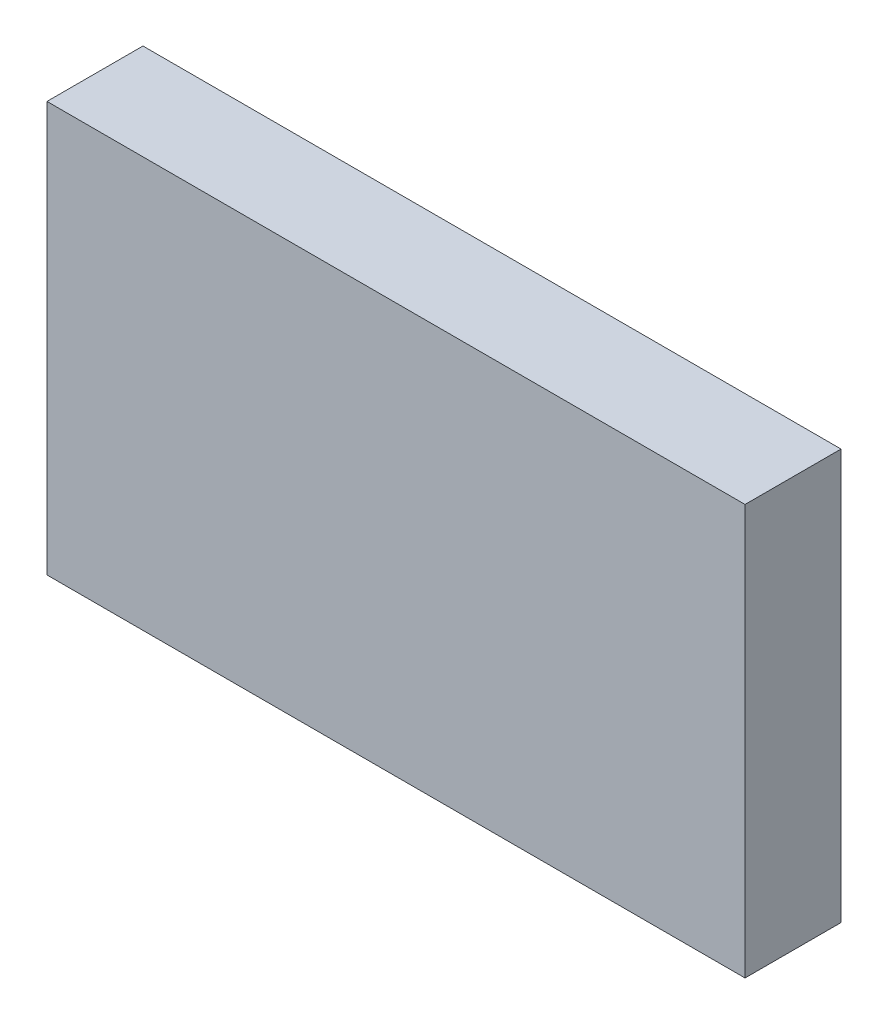
ISO-10303-21;
HEADER;
FILE_DESCRIPTION(('STEP AP214'),'2;1');
FILE_NAME('part.step','',(''),(''),'','','');
FILE_SCHEMA(('AUTOMOTIVE_DESIGN { 1 0 10303 214 1 1 1 1 }'));
ENDSEC;
DATA;
#1=APPLICATION_CONTEXT('core data for automotive mechanical design processes');
#2=APPLICATION_PROTOCOL_DEFINITION('international standard','automotive_design',2000,#1);
#3=PRODUCT_CONTEXT('',#1,'mechanical');
#4=PRODUCT('Part','Part','',(#3));
#5=PRODUCT_RELATED_PRODUCT_CATEGORY('part','',(#4));
#6=PRODUCT_DEFINITION_FORMATION('','',#4);
#7=PRODUCT_DEFINITION_CONTEXT('part definition',#1,'design');
#8=PRODUCT_DEFINITION('design','',#6,#7);
#9=PRODUCT_DEFINITION_SHAPE('','',#8);
#10=(LENGTH_UNIT() NAMED_UNIT(*) SI_UNIT(.MILLI.,.METRE.));
#11=(NAMED_UNIT(*) PLANE_ANGLE_UNIT() SI_UNIT($,.RADIAN.));
#12=(NAMED_UNIT(*) SI_UNIT($,.STERADIAN.) SOLID_ANGLE_UNIT());
#13=UNCERTAINTY_MEASURE_WITH_UNIT(LENGTH_MEASURE(1.E-05),#10,'distance_accuracy_value','');
#14=(GEOMETRIC_REPRESENTATION_CONTEXT(3) GLOBAL_UNCERTAINTY_ASSIGNED_CONTEXT((#13)) GLOBAL_UNIT_ASSIGNED_CONTEXT((#10,
#11,#12)) REPRESENTATION_CONTEXT('',''));
#15=CARTESIAN_POINT('',(0.,0.,0.));
#16=DIRECTION('',(0.,0.,1.));
#17=DIRECTION('',(1.,0.,0.));
#18=AXIS2_PLACEMENT_3D('',#15,#16,#17);
#19=CARTESIAN_POINT('',(-16.,-9.4,4.4));
#20=DIRECTION('',(-1.,0.,0.));
#21=DIRECTION('',(0.,0.,1.));
#22=AXIS2_PLACEMENT_3D('',#19,#20,#21);
#23=PLANE('',#22);
#24=DIRECTION('',(0.,1.,0.));
#25=VECTOR('',#24,1.);
#26=CARTESIAN_POINT('',(-16.,-9.4,0.));
#27=LINE('',#26,#25);
#28=CARTESIAN_POINT('',(-16.,-9.4,0.));
#29=VERTEX_POINT('',#28);
#30=CARTESIAN_POINT('',(-16.,9.4,0.));
#31=VERTEX_POINT('',#30);
#32=EDGE_CURVE('E104',#29,#31,#27,.T.);
#33=ORIENTED_EDGE('',*,*,#32,.F.);
#34=DIRECTION('',(0.,0.,-1.));
#35=VECTOR('',#34,1.);
#36=CARTESIAN_POINT('',(-16.,-9.4,4.4));
#37=LINE('',#36,#35);
#38=CARTESIAN_POINT('',(-16.,-9.4,4.4));
#39=VERTEX_POINT('',#38);
#40=EDGE_CURVE('E11',#39,#29,#37,.T.);
#41=ORIENTED_EDGE('',*,*,#40,.F.);
#42=DIRECTION('',(0.,1.,0.));
#43=VECTOR('',#42,1.);
#44=CARTESIAN_POINT('',(-16.,-9.4,4.4));
#45=LINE('',#44,#43);
#46=CARTESIAN_POINT('',(-16.,9.4,4.4));
#47=VERTEX_POINT('',#46);
#48=EDGE_CURVE('E99',#39,#47,#45,.T.);
#49=ORIENTED_EDGE('',*,*,#48,.T.);
#50=DIRECTION('',(0.,0.,-1.));
#51=VECTOR('',#50,1.);
#52=CARTESIAN_POINT('',(-16.,9.4,4.4));
#53=LINE('',#52,#51);
#54=EDGE_CURVE('E42',#47,#31,#53,.T.);
#55=ORIENTED_EDGE('',*,*,#54,.T.);
#56=EDGE_LOOP('',(#33,#41,#49,#55));
#57=FACE_BOUND('',#56,.T.);
#58=ADVANCED_FACE('F39',(#57),#23,.T.);
#59=CARTESIAN_POINT('',(-16.,-9.4,4.4));
#60=DIRECTION('',(0.,1.,0.));
#61=DIRECTION('',(0.,0.,1.));
#62=AXIS2_PLACEMENT_3D('',#59,#60,#61);
#63=PLANE('',#62);
#64=DIRECTION('',(1.,0.,0.));
#65=VECTOR('',#64,1.);
#66=CARTESIAN_POINT('',(-16.,-9.4,0.));
#67=LINE('',#66,#65);
#68=CARTESIAN_POINT('',(16.,-9.4,0.));
#69=VERTEX_POINT('',#68);
#70=EDGE_CURVE('E72',#29,#69,#67,.T.);
#71=ORIENTED_EDGE('',*,*,#70,.T.);
#72=DIRECTION('',(0.,0.,-1.));
#73=VECTOR('',#72,1.);
#74=CARTESIAN_POINT('',(16.,-9.4,4.4));
#75=LINE('',#74,#73);
#76=CARTESIAN_POINT('',(16.,-9.4,4.4));
#77=VERTEX_POINT('',#76);
#78=EDGE_CURVE('E48',#77,#69,#75,.T.);
#79=ORIENTED_EDGE('',*,*,#78,.F.);
#80=DIRECTION('',(1.,0.,0.));
#81=VECTOR('',#80,1.);
#82=CARTESIAN_POINT('',(-16.,-9.4,4.4));
#83=LINE('',#82,#81);
#84=EDGE_CURVE('E89',#39,#77,#83,.T.);
#85=ORIENTED_EDGE('',*,*,#84,.F.);
#86=ORIENTED_EDGE('',*,*,#40,.T.);
#87=EDGE_LOOP('',(#71,#79,#85,#86));
#88=FACE_BOUND('',#87,.T.);
#89=ADVANCED_FACE('F114',(#88),#63,.F.);
#90=CARTESIAN_POINT('',(16.,-9.4,4.4));
#91=DIRECTION('',(-1.,0.,0.));
#92=DIRECTION('',(0.,0.,1.));
#93=AXIS2_PLACEMENT_3D('',#90,#91,#92);
#94=PLANE('',#93);
#95=DIRECTION('',(0.,1.,0.));
#96=VECTOR('',#95,1.);
#97=CARTESIAN_POINT('',(16.,-9.4,0.));
#98=LINE('',#97,#96);
#99=CARTESIAN_POINT('',(16.,9.4,0.));
#100=VERTEX_POINT('',#99);
#101=EDGE_CURVE('E96',#69,#100,#98,.T.);
#102=ORIENTED_EDGE('',*,*,#101,.T.);
#103=DIRECTION('',(0.,0.,-1.));
#104=VECTOR('',#103,1.);
#105=CARTESIAN_POINT('',(16.,9.4,4.4));
#106=LINE('',#105,#104);
#107=CARTESIAN_POINT('',(16.,9.4,4.4));
#108=VERTEX_POINT('',#107);
#109=EDGE_CURVE('E93',#108,#100,#106,.T.);
#110=ORIENTED_EDGE('',*,*,#109,.F.);
#111=DIRECTION('',(0.,1.,0.));
#112=VECTOR('',#111,1.);
#113=CARTESIAN_POINT('',(16.,-9.4,4.4));
#114=LINE('',#113,#112);
#115=EDGE_CURVE('E84',#77,#108,#114,.T.);
#116=ORIENTED_EDGE('',*,*,#115,.F.);
#117=ORIENTED_EDGE('',*,*,#78,.T.);
#118=EDGE_LOOP('',(#102,#110,#116,#117));
#119=FACE_BOUND('',#118,.T.);
#120=ADVANCED_FACE('F94',(#119),#94,.F.);
#121=CARTESIAN_POINT('',(-16.,9.4,4.4));
#122=DIRECTION('',(0.,1.,0.));
#123=DIRECTION('',(0.,0.,1.));
#124=AXIS2_PLACEMENT_3D('',#121,#122,#123);
#125=PLANE('',#124);
#126=DIRECTION('',(1.,0.,0.));
#127=VECTOR('',#126,1.);
#128=CARTESIAN_POINT('',(-16.,9.4,0.));
#129=LINE('',#128,#127);
#130=EDGE_CURVE('E107',#31,#100,#129,.T.);
#131=ORIENTED_EDGE('',*,*,#130,.F.);
#132=ORIENTED_EDGE('',*,*,#54,.F.);
#133=DIRECTION('',(1.,0.,0.));
#134=VECTOR('',#133,1.);
#135=CARTESIAN_POINT('',(-16.,9.4,4.4));
#136=LINE('',#135,#134);
#137=EDGE_CURVE('E88',#47,#108,#136,.T.);
#138=ORIENTED_EDGE('',*,*,#137,.T.);
#139=ORIENTED_EDGE('',*,*,#109,.T.);
#140=EDGE_LOOP('',(#131,#132,#138,#139));
#141=FACE_BOUND('',#140,.T.);
#142=ADVANCED_FACE('F98',(#141),#125,.T.);
#143=CARTESIAN_POINT('',(0.,0.,4.4));
#144=DIRECTION('',(0.,0.,-1.));
#145=DIRECTION('',(-1.,0.,0.));
#146=AXIS2_PLACEMENT_3D('',#143,#144,#145);
#147=PLANE('',#146);
#148=ORIENTED_EDGE('',*,*,#48,.F.);
#149=ORIENTED_EDGE('',*,*,#84,.T.);
#150=ORIENTED_EDGE('',*,*,#115,.T.);
#151=ORIENTED_EDGE('',*,*,#137,.F.);
#152=EDGE_LOOP('',(#148,#149,#150,#151));
#153=FACE_BOUND('',#152,.T.);
#154=ADVANCED_FACE('F87',(#153),#147,.F.);
#155=CARTESIAN_POINT('',(0.,0.,0.));
#156=DIRECTION('',(0.,0.,-1.));
#157=DIRECTION('',(-1.,0.,0.));
#158=AXIS2_PLACEMENT_3D('',#155,#156,#157);
#159=PLANE('',#158);
#160=ORIENTED_EDGE('',*,*,#32,.T.);
#161=ORIENTED_EDGE('',*,*,#130,.T.);
#162=ORIENTED_EDGE('',*,*,#101,.F.);
#163=ORIENTED_EDGE('',*,*,#70,.F.);
#164=EDGE_LOOP('',(#160,#161,#162,#163));
#165=FACE_BOUND('',#164,.T.);
#166=ADVANCED_FACE('F112',(#165),#159,.T.);
#167=CLOSED_SHELL('',(#58,#89,#120,#142,#154,#166));
#168=MANIFOLD_SOLID_BREP('B2',#167);
#169=ADVANCED_BREP_SHAPE_REPRESENTATION('',(#18,#168),#14);
#170=SHAPE_DEFINITION_REPRESENTATION(#9,#169);
ENDSEC;
END-ISO-10303-21;
